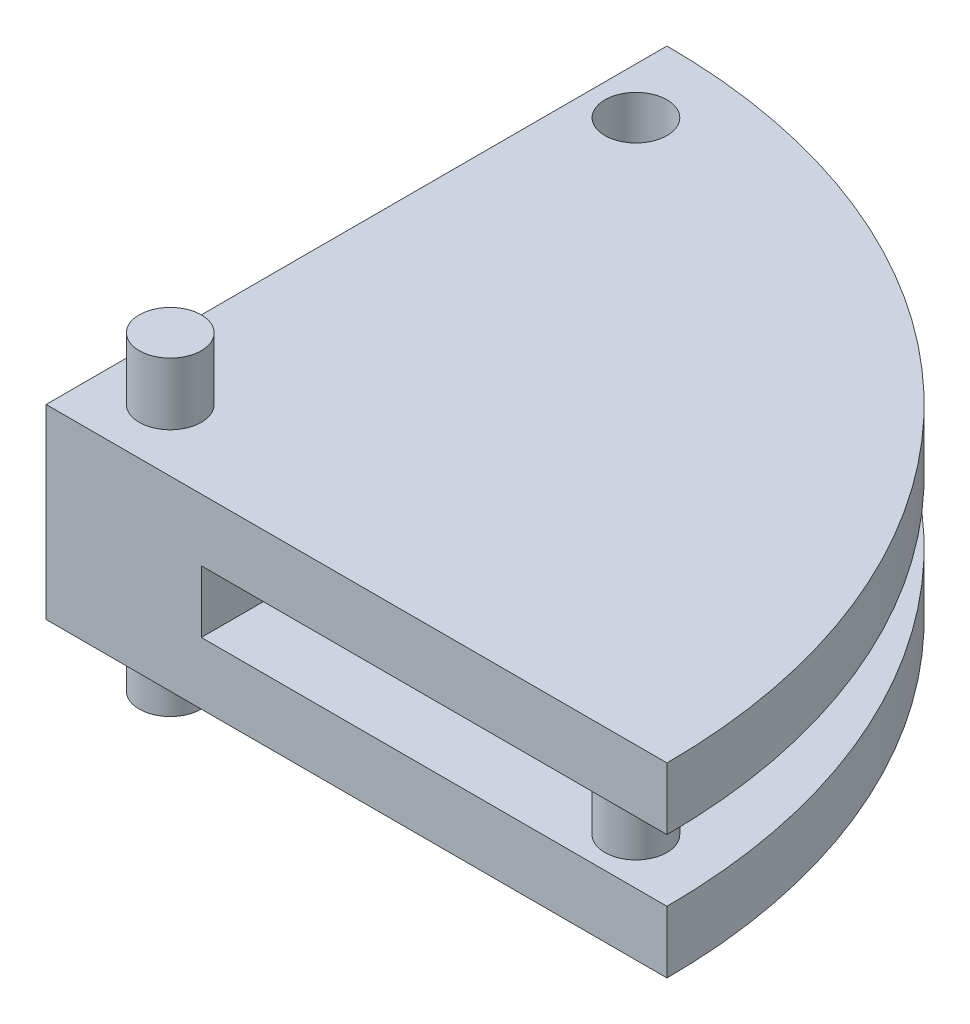
ISO-10303-21;
HEADER;
FILE_DESCRIPTION(('STEP AP214'),'2;1');
FILE_NAME('part.step','',(''),(''),'','','');
FILE_SCHEMA(('AUTOMOTIVE_DESIGN { 1 0 10303 214 1 1 1 1 }'));
ENDSEC;
DATA;
#1=APPLICATION_CONTEXT('core data for automotive mechanical design processes');
#2=APPLICATION_PROTOCOL_DEFINITION('international standard','automotive_design',2000,#1);
#3=PRODUCT_CONTEXT('',#1,'mechanical');
#4=PRODUCT('Part','Part','',(#3));
#5=PRODUCT_RELATED_PRODUCT_CATEGORY('part','',(#4));
#6=PRODUCT_DEFINITION_FORMATION('','',#4);
#7=PRODUCT_DEFINITION_CONTEXT('part definition',#1,'design');
#8=PRODUCT_DEFINITION('design','',#6,#7);
#9=PRODUCT_DEFINITION_SHAPE('','',#8);
#10=(LENGTH_UNIT() NAMED_UNIT(*) SI_UNIT(.MILLI.,.METRE.));
#11=(NAMED_UNIT(*) PLANE_ANGLE_UNIT() SI_UNIT($,.RADIAN.));
#12=(NAMED_UNIT(*) SI_UNIT($,.STERADIAN.) SOLID_ANGLE_UNIT());
#13=UNCERTAINTY_MEASURE_WITH_UNIT(LENGTH_MEASURE(1.E-05),#10,'distance_accuracy_value','');
#14=(GEOMETRIC_REPRESENTATION_CONTEXT(3) GLOBAL_UNCERTAINTY_ASSIGNED_CONTEXT((#13)) GLOBAL_UNIT_ASSIGNED_CONTEXT((#10,
#11,#12)) REPRESENTATION_CONTEXT('',''));
#15=CARTESIAN_POINT('',(0.,0.,0.));
#16=DIRECTION('',(0.,0.,1.));
#17=DIRECTION('',(1.,0.,0.));
#18=AXIS2_PLACEMENT_3D('',#15,#16,#17);
#19=CARTESIAN_POINT('',(0.,1.,0.));
#20=DIRECTION('',(0.,-1.,0.));
#21=DIRECTION('',(0.,0.,-1.));
#22=AXIS2_PLACEMENT_3D('',#19,#20,#21);
#23=PLANE('',#22);
#24=CARTESIAN_POINT('',(0.75,1.,-8.75));
#25=DIRECTION('',(0.,-1.,0.));
#26=DIRECTION('',(0.,0.,-1.));
#27=AXIS2_PLACEMENT_3D('',#24,#25,#26);
#28=CIRCLE('',#27,0.5);
#29=CARTESIAN_POINT('',(0.75,1.,-9.25));
#30=VERTEX_POINT('',#29);
#31=EDGE_CURVE('E170',#30,#30,#28,.T.);
#32=ORIENTED_EDGE('',*,*,#31,.T.);
#33=EDGE_LOOP('',(#32));
#34=FACE_BOUND('',#33,.T.);
#35=CARTESIAN_POINT('',(8.75,1.,-0.75));
#36=DIRECTION('',(0.,-1.,0.));
#37=DIRECTION('',(0.,0.,-1.));
#38=AXIS2_PLACEMENT_3D('',#35,#36,#37);
#39=CIRCLE('',#38,0.500000000000001);
#40=CARTESIAN_POINT('',(8.75,1.,-1.25));
#41=VERTEX_POINT('',#40);
#42=EDGE_CURVE('E42',#41,#41,#39,.F.);
#43=ORIENTED_EDGE('',*,*,#42,.F.);
#44=EDGE_LOOP('',(#43));
#45=FACE_BOUND('',#44,.T.);
#46=DIRECTION('',(-1.,0.,0.));
#47=VECTOR('',#46,1.);
#48=CARTESIAN_POINT('',(0.,1.,-2.5));
#49=LINE('',#48,#47);
#50=CARTESIAN_POINT('',(2.5,1.,-2.5));
#51=VERTEX_POINT('',#50);
#52=CARTESIAN_POINT('',(0.,1.,-2.5));
#53=VERTEX_POINT('',#52);
#54=EDGE_CURVE('E135',#51,#53,#49,.T.);
#55=ORIENTED_EDGE('',*,*,#54,.F.);
#56=DIRECTION('',(0.,0.,-1.));
#57=VECTOR('',#56,1.);
#58=CARTESIAN_POINT('',(2.5,1.,0.));
#59=LINE('',#58,#57);
#60=CARTESIAN_POINT('',(2.5,1.,0.));
#61=VERTEX_POINT('',#60);
#62=EDGE_CURVE('E50',#61,#51,#59,.T.);
#63=ORIENTED_EDGE('',*,*,#62,.F.);
#64=DIRECTION('',(1.,0.,0.));
#65=VECTOR('',#64,1.);
#66=CARTESIAN_POINT('',(0.,1.,0.));
#67=LINE('',#66,#65);
#68=CARTESIAN_POINT('',(10.,1.,0.));
#69=VERTEX_POINT('',#68);
#70=EDGE_CURVE('E151',#61,#69,#67,.T.);
#71=ORIENTED_EDGE('',*,*,#70,.T.);
#72=CARTESIAN_POINT('',(0.,1.,0.));
#73=DIRECTION('',(0.,1.,0.));
#74=DIRECTION('',(0.,0.,-1.));
#75=AXIS2_PLACEMENT_3D('',#72,#73,#74);
#76=CIRCLE('',#75,10.);
#77=CARTESIAN_POINT('',(0.,1.,-10.));
#78=VERTEX_POINT('',#77);
#79=EDGE_CURVE('E154',#69,#78,#76,.T.);
#80=ORIENTED_EDGE('',*,*,#79,.T.);
#81=DIRECTION('',(0.,0.,1.));
#82=VECTOR('',#81,1.);
#83=CARTESIAN_POINT('',(0.,1.,0.));
#84=LINE('',#83,#82);
#85=EDGE_CURVE('E56',#78,#53,#84,.T.);
#86=ORIENTED_EDGE('',*,*,#85,.T.);
#87=EDGE_LOOP('',(#55,#63,#71,#80,#86));
#88=FACE_BOUND('',#87,.T.);
#89=ADVANCED_FACE('F33',(#34,#45,#88),#23,.F.);
#90=CARTESIAN_POINT('',(0.,1.,0.));
#91=DIRECTION('',(1.,0.,0.));
#92=DIRECTION('',(0.,0.,-1.));
#93=AXIS2_PLACEMENT_3D('',#90,#91,#92);
#94=PLANE('',#93);
#95=DIRECTION('',(0.,0.,1.));
#96=VECTOR('',#95,1.);
#97=CARTESIAN_POINT('',(0.,0.,0.));
#98=LINE('',#97,#96);
#99=CARTESIAN_POINT('',(0.,0.,-10.));
#100=VERTEX_POINT('',#99);
#101=CARTESIAN_POINT('',(0.,0.,0.));
#102=VERTEX_POINT('',#101);
#103=EDGE_CURVE('E149',#100,#102,#98,.T.);
#104=ORIENTED_EDGE('',*,*,#103,.T.);
#105=DIRECTION('',(0.,-1.,0.));
#106=VECTOR('',#105,1.);
#107=CARTESIAN_POINT('',(0.,1.,0.));
#108=LINE('',#107,#106);
#109=CARTESIAN_POINT('',(0.,3.,0.));
#110=VERTEX_POINT('',#109);
#111=EDGE_CURVE('E107',#110,#102,#108,.T.);
#112=ORIENTED_EDGE('',*,*,#111,.F.);
#113=DIRECTION('',(0.,0.,1.));
#114=VECTOR('',#113,1.);
#115=CARTESIAN_POINT('',(0.,3.,-10.));
#116=LINE('',#115,#114);
#117=CARTESIAN_POINT('',(0.,3.,-10.));
#118=VERTEX_POINT('',#117);
#119=EDGE_CURVE('E99',#118,#110,#116,.T.);
#120=ORIENTED_EDGE('',*,*,#119,.F.);
#121=DIRECTION('',(0.,-1.,0.));
#122=VECTOR('',#121,1.);
#123=CARTESIAN_POINT('',(0.,3.,-10.));
#124=LINE('',#123,#122);
#125=CARTESIAN_POINT('',(0.,2.,-10.));
#126=VERTEX_POINT('',#125);
#127=EDGE_CURVE('E104',#118,#126,#124,.T.);
#128=ORIENTED_EDGE('',*,*,#127,.T.);
#129=DIRECTION('',(0.,0.,1.));
#130=VECTOR('',#129,1.);
#131=CARTESIAN_POINT('',(0.,2.,-10.));
#132=LINE('',#131,#130);
#133=CARTESIAN_POINT('',(0.,2.,-2.5));
#134=VERTEX_POINT('',#133);
#135=EDGE_CURVE('E187',#126,#134,#132,.T.);
#136=ORIENTED_EDGE('',*,*,#135,.T.);
#137=DIRECTION('',(0.,-1.,0.));
#138=VECTOR('',#137,1.);
#139=CARTESIAN_POINT('',(0.,2.,-2.5));
#140=LINE('',#139,#138);
#141=EDGE_CURVE('E138',#134,#53,#140,.T.);
#142=ORIENTED_EDGE('',*,*,#141,.T.);
#143=ORIENTED_EDGE('',*,*,#85,.F.);
#144=DIRECTION('',(0.,-1.,0.));
#145=VECTOR('',#144,1.);
#146=CARTESIAN_POINT('',(0.,1.,-10.));
#147=LINE('',#146,#145);
#148=EDGE_CURVE('E156',#78,#100,#147,.T.);
#149=ORIENTED_EDGE('',*,*,#148,.T.);
#150=EDGE_LOOP('',(#104,#112,#120,#128,#136,#142,#143,#149));
#151=FACE_BOUND('',#150,.T.);
#152=ADVANCED_FACE('F35',(#151),#94,.F.);
#153=CARTESIAN_POINT('',(0.,1.,0.));
#154=DIRECTION('',(0.,0.,-1.));
#155=DIRECTION('',(-1.,0.,0.));
#156=AXIS2_PLACEMENT_3D('',#153,#154,#155);
#157=PLANE('',#156);
#158=DIRECTION('',(1.,0.,0.));
#159=VECTOR('',#158,1.);
#160=CARTESIAN_POINT('',(0.,0.,0.));
#161=LINE('',#160,#159);
#162=CARTESIAN_POINT('',(10.,0.,0.));
#163=VERTEX_POINT('',#162);
#164=EDGE_CURVE('E158',#102,#163,#161,.T.);
#165=ORIENTED_EDGE('',*,*,#164,.T.);
#166=DIRECTION('',(0.,-1.,0.));
#167=VECTOR('',#166,1.);
#168=CARTESIAN_POINT('',(10.,1.,0.));
#169=LINE('',#168,#167);
#170=EDGE_CURVE('E163',#69,#163,#169,.T.);
#171=ORIENTED_EDGE('',*,*,#170,.F.);
#172=ORIENTED_EDGE('',*,*,#70,.F.);
#173=DIRECTION('',(0.,-1.,0.));
#174=VECTOR('',#173,1.);
#175=CARTESIAN_POINT('',(2.5,2.,0.));
#176=LINE('',#175,#174);
#177=CARTESIAN_POINT('',(2.5,2.,0.));
#178=VERTEX_POINT('',#177);
#179=EDGE_CURVE('E146',#178,#61,#176,.T.);
#180=ORIENTED_EDGE('',*,*,#179,.F.);
#181=DIRECTION('',(1.,0.,0.));
#182=VECTOR('',#181,1.);
#183=CARTESIAN_POINT('',(0.,2.,0.));
#184=LINE('',#183,#182);
#185=CARTESIAN_POINT('',(10.,2.,0.));
#186=VERTEX_POINT('',#185);
#187=EDGE_CURVE('E118',#178,#186,#184,.T.);
#188=ORIENTED_EDGE('',*,*,#187,.T.);
#189=DIRECTION('',(0.,-1.,0.));
#190=VECTOR('',#189,1.);
#191=CARTESIAN_POINT('',(10.,3.,0.));
#192=LINE('',#191,#190);
#193=CARTESIAN_POINT('',(10.,3.,0.));
#194=VERTEX_POINT('',#193);
#195=EDGE_CURVE('E124',#194,#186,#192,.T.);
#196=ORIENTED_EDGE('',*,*,#195,.F.);
#197=DIRECTION('',(1.,0.,0.));
#198=VECTOR('',#197,1.);
#199=CARTESIAN_POINT('',(0.,3.,0.));
#200=LINE('',#199,#198);
#201=EDGE_CURVE('E110',#110,#194,#200,.T.);
#202=ORIENTED_EDGE('',*,*,#201,.F.);
#203=ORIENTED_EDGE('',*,*,#111,.T.);
#204=EDGE_LOOP('',(#165,#171,#172,#180,#188,#196,#202,#203));
#205=FACE_BOUND('',#204,.T.);
#206=ADVANCED_FACE('F190',(#205),#157,.F.);
#207=CARTESIAN_POINT('',(0.,1.,0.));
#208=DIRECTION('',(0.,-1.,0.));
#209=DIRECTION('',(0.,0.,-1.));
#210=AXIS2_PLACEMENT_3D('',#207,#208,#209);
#211=CYLINDRICAL_SURFACE('',#210,10.);
#212=CARTESIAN_POINT('',(0.,0.,0.));
#213=DIRECTION('',(0.,1.,0.));
#214=DIRECTION('',(0.,0.,-1.));
#215=AXIS2_PLACEMENT_3D('',#212,#213,#214);
#216=CIRCLE('',#215,10.);
#217=EDGE_CURVE('E152',#163,#100,#216,.T.);
#218=ORIENTED_EDGE('',*,*,#217,.T.);
#219=ORIENTED_EDGE('',*,*,#148,.F.);
#220=ORIENTED_EDGE('',*,*,#79,.F.);
#221=ORIENTED_EDGE('',*,*,#170,.T.);
#222=EDGE_LOOP('',(#218,#219,#220,#221));
#223=FACE_BOUND('',#222,.T.);
#224=ADVANCED_FACE('F208',(#223),#211,.T.);
#225=CARTESIAN_POINT('',(0.,0.,0.));
#226=DIRECTION('',(0.,-1.,0.));
#227=DIRECTION('',(0.,0.,-1.));
#228=AXIS2_PLACEMENT_3D('',#225,#226,#227);
#229=PLANE('',#228);
#230=CARTESIAN_POINT('',(1.,0.,-1.));
#231=DIRECTION('',(0.,-1.,0.));
#232=DIRECTION('',(0.,0.,-1.));
#233=AXIS2_PLACEMENT_3D('',#230,#231,#232);
#234=CIRCLE('',#233,0.5);
#235=CARTESIAN_POINT('',(1.,0.,-1.5));
#236=VERTEX_POINT('',#235);
#237=EDGE_CURVE('E11',#236,#236,#234,.T.);
#238=ORIENTED_EDGE('',*,*,#237,.F.);
#239=EDGE_LOOP('',(#238));
#240=FACE_BOUND('',#239,.T.);
#241=CARTESIAN_POINT('',(0.75,0.,-8.75));
#242=DIRECTION('',(0.,1.,0.));
#243=DIRECTION('',(0.,0.,1.));
#244=AXIS2_PLACEMENT_3D('',#241,#242,#243);
#245=CIRCLE('',#244,0.5);
#246=CARTESIAN_POINT('',(0.75,0.,-8.25));
#247=VERTEX_POINT('',#246);
#248=EDGE_CURVE('E171',#247,#247,#245,.T.);
#249=ORIENTED_EDGE('',*,*,#248,.T.);
#250=EDGE_LOOP('',(#249));
#251=FACE_BOUND('',#250,.T.);
#252=ORIENTED_EDGE('',*,*,#103,.F.);
#253=ORIENTED_EDGE('',*,*,#217,.F.);
#254=ORIENTED_EDGE('',*,*,#164,.F.);
#255=EDGE_LOOP('',(#252,#253,#254));
#256=FACE_BOUND('',#255,.T.);
#257=ADVANCED_FACE('F200',(#240,#251,#256),#229,.T.);
#258=CARTESIAN_POINT('',(2.5,2.,0.));
#259=DIRECTION('',(-1.,0.,0.));
#260=DIRECTION('',(0.,0.,1.));
#261=AXIS2_PLACEMENT_3D('',#258,#259,#260);
#262=PLANE('',#261);
#263=ORIENTED_EDGE('',*,*,#62,.T.);
#264=DIRECTION('',(0.,-1.,0.));
#265=VECTOR('',#264,1.);
#266=CARTESIAN_POINT('',(2.5,2.,-2.5));
#267=LINE('',#266,#265);
#268=CARTESIAN_POINT('',(2.5,2.,-2.5));
#269=VERTEX_POINT('',#268);
#270=EDGE_CURVE('E143',#269,#51,#267,.T.);
#271=ORIENTED_EDGE('',*,*,#270,.F.);
#272=DIRECTION('',(0.,0.,-1.));
#273=VECTOR('',#272,1.);
#274=CARTESIAN_POINT('',(2.5,2.,0.));
#275=LINE('',#274,#273);
#276=EDGE_CURVE('E131',#178,#269,#275,.T.);
#277=ORIENTED_EDGE('',*,*,#276,.F.);
#278=ORIENTED_EDGE('',*,*,#179,.T.);
#279=EDGE_LOOP('',(#263,#271,#277,#278));
#280=FACE_BOUND('',#279,.T.);
#281=ADVANCED_FACE('F198',(#280),#262,.F.);
#282=CARTESIAN_POINT('',(0.,2.,-2.5));
#283=DIRECTION('',(0.,0.,1.));
#284=DIRECTION('',(1.,0.,0.));
#285=AXIS2_PLACEMENT_3D('',#282,#283,#284);
#286=PLANE('',#285);
#287=ORIENTED_EDGE('',*,*,#54,.T.);
#288=ORIENTED_EDGE('',*,*,#141,.F.);
#289=DIRECTION('',(-1.,0.,0.));
#290=VECTOR('',#289,1.);
#291=CARTESIAN_POINT('',(0.,2.,-2.5));
#292=LINE('',#291,#290);
#293=EDGE_CURVE('E134',#269,#134,#292,.T.);
#294=ORIENTED_EDGE('',*,*,#293,.F.);
#295=ORIENTED_EDGE('',*,*,#270,.T.);
#296=EDGE_LOOP('',(#287,#288,#294,#295));
#297=FACE_BOUND('',#296,.T.);
#298=ADVANCED_FACE('F196',(#297),#286,.F.);
#299=CARTESIAN_POINT('',(8.75,2.,-0.75));
#300=DIRECTION('',(0.,-1.,0.));
#301=DIRECTION('',(0.,0.,-1.));
#302=AXIS2_PLACEMENT_3D('',#299,#300,#301);
#303=CYLINDRICAL_SURFACE('',#302,0.500000000000001);
#304=CARTESIAN_POINT('',(8.75,2.,-0.75));
#305=DIRECTION('',(0.,1.,0.));
#306=DIRECTION('',(0.,0.,1.));
#307=AXIS2_PLACEMENT_3D('',#304,#305,#306);
#308=CIRCLE('',#307,0.500000000000001);
#309=CARTESIAN_POINT('',(8.75,2.,-0.249999999999999));
#310=VERTEX_POINT('',#309);
#311=EDGE_CURVE('E123',#310,#310,#308,.T.);
#312=ORIENTED_EDGE('',*,*,#311,.F.);
#313=EDGE_LOOP('',(#312));
#314=FACE_BOUND('',#313,.T.);
#315=ORIENTED_EDGE('',*,*,#42,.T.);
#316=EDGE_LOOP('',(#315));
#317=FACE_BOUND('',#316,.T.);
#318=ADVANCED_FACE('F206',(#314,#317),#303,.T.);
#319=CARTESIAN_POINT('',(0.,3.,0.));
#320=DIRECTION('',(0.,-1.,0.));
#321=DIRECTION('',(0.,0.,-1.));
#322=AXIS2_PLACEMENT_3D('',#319,#320,#321);
#323=CYLINDRICAL_SURFACE('',#322,10.);
#324=CARTESIAN_POINT('',(0.,2.,0.));
#325=DIRECTION('',(0.,1.,0.));
#326=DIRECTION('',(0.,0.,-1.));
#327=AXIS2_PLACEMENT_3D('',#324,#325,#326);
#328=CIRCLE('',#327,10.);
#329=EDGE_CURVE('E122',#186,#126,#328,.T.);
#330=ORIENTED_EDGE('',*,*,#329,.T.);
#331=ORIENTED_EDGE('',*,*,#127,.F.);
#332=CARTESIAN_POINT('',(0.,3.,0.));
#333=DIRECTION('',(0.,1.,0.));
#334=DIRECTION('',(0.,0.,-1.));
#335=AXIS2_PLACEMENT_3D('',#332,#333,#334);
#336=CIRCLE('',#335,10.);
#337=EDGE_CURVE('E111',#194,#118,#336,.T.);
#338=ORIENTED_EDGE('',*,*,#337,.F.);
#339=ORIENTED_EDGE('',*,*,#195,.T.);
#340=EDGE_LOOP('',(#330,#331,#338,#339));
#341=FACE_BOUND('',#340,.T.);
#342=ADVANCED_FACE('F120',(#341),#323,.T.);
#343=CARTESIAN_POINT('',(0.,3.,0.));
#344=DIRECTION('',(0.,-1.,0.));
#345=DIRECTION('',(0.,0.,-1.));
#346=AXIS2_PLACEMENT_3D('',#343,#344,#345);
#347=PLANE('',#346);
#348=CARTESIAN_POINT('',(1.,3.,-1.));
#349=DIRECTION('',(0.,-1.,0.));
#350=DIRECTION('',(0.,0.,-1.));
#351=AXIS2_PLACEMENT_3D('',#348,#349,#350);
#352=CIRCLE('',#351,0.5);
#353=CARTESIAN_POINT('',(1.,3.,-1.5));
#354=VERTEX_POINT('',#353);
#355=EDGE_CURVE('E37',#354,#354,#352,.T.);
#356=ORIENTED_EDGE('',*,*,#355,.T.);
#357=EDGE_LOOP('',(#356));
#358=FACE_BOUND('',#357,.T.);
#359=CARTESIAN_POINT('',(0.75,3.,-8.75));
#360=DIRECTION('',(0.,1.,0.));
#361=DIRECTION('',(0.,0.,1.));
#362=AXIS2_PLACEMENT_3D('',#359,#360,#361);
#363=CIRCLE('',#362,0.5);
#364=CARTESIAN_POINT('',(0.75,3.,-8.25));
#365=VERTEX_POINT('',#364);
#366=EDGE_CURVE('E177',#365,#365,#363,.T.);
#367=ORIENTED_EDGE('',*,*,#366,.F.);
#368=EDGE_LOOP('',(#367));
#369=FACE_BOUND('',#368,.T.);
#370=ORIENTED_EDGE('',*,*,#337,.T.);
#371=ORIENTED_EDGE('',*,*,#119,.T.);
#372=ORIENTED_EDGE('',*,*,#201,.T.);
#373=EDGE_LOOP('',(#370,#371,#372));
#374=FACE_BOUND('',#373,.T.);
#375=ADVANCED_FACE('F114',(#358,#369,#374),#347,.F.);
#376=CARTESIAN_POINT('',(0.,2.,0.));
#377=DIRECTION('',(0.,-1.,0.));
#378=DIRECTION('',(0.,0.,-1.));
#379=AXIS2_PLACEMENT_3D('',#376,#377,#378);
#380=PLANE('',#379);
#381=CARTESIAN_POINT('',(0.75,2.,-8.75));
#382=DIRECTION('',(0.,-1.,0.));
#383=DIRECTION('',(0.,0.,-1.));
#384=AXIS2_PLACEMENT_3D('',#381,#382,#383);
#385=CIRCLE('',#384,0.5);
#386=CARTESIAN_POINT('',(0.75,2.,-9.25));
#387=VERTEX_POINT('',#386);
#388=EDGE_CURVE('E168',#387,#387,#385,.T.);
#389=ORIENTED_EDGE('',*,*,#388,.F.);
#390=EDGE_LOOP('',(#389));
#391=FACE_BOUND('',#390,.T.);
#392=ORIENTED_EDGE('',*,*,#311,.T.);
#393=EDGE_LOOP('',(#392));
#394=FACE_BOUND('',#393,.T.);
#395=ORIENTED_EDGE('',*,*,#187,.F.);
#396=ORIENTED_EDGE('',*,*,#276,.T.);
#397=ORIENTED_EDGE('',*,*,#293,.T.);
#398=ORIENTED_EDGE('',*,*,#135,.F.);
#399=ORIENTED_EDGE('',*,*,#329,.F.);
#400=EDGE_LOOP('',(#395,#396,#397,#398,#399));
#401=FACE_BOUND('',#400,.T.);
#402=ADVANCED_FACE('F193',(#391,#394,#401),#380,.T.);
#403=CARTESIAN_POINT('',(0.75,0.,-8.75));
#404=DIRECTION('',(0.,1.,0.));
#405=DIRECTION('',(0.,0.,1.));
#406=AXIS2_PLACEMENT_3D('',#403,#404,#405);
#407=CYLINDRICAL_SURFACE('',#406,0.5);
#408=ORIENTED_EDGE('',*,*,#388,.T.);
#409=EDGE_LOOP('',(#408));
#410=FACE_BOUND('',#409,.T.);
#411=ORIENTED_EDGE('',*,*,#366,.T.);
#412=EDGE_LOOP('',(#411));
#413=FACE_BOUND('',#412,.T.);
#414=ADVANCED_FACE('F300',(#410,#413),#407,.F.);
#415=ORIENTED_EDGE('',*,*,#248,.F.);
#416=EDGE_LOOP('',(#415));
#417=FACE_BOUND('',#416,.T.);
#418=ORIENTED_EDGE('',*,*,#31,.F.);
#419=EDGE_LOOP('',(#418));
#420=FACE_BOUND('',#419,.T.);
#421=ADVANCED_FACE('F242',(#417,#420),#407,.F.);
#422=CARTESIAN_POINT('',(1.,4.,-1.));
#423=DIRECTION('',(0.,1.,0.));
#424=DIRECTION('',(0.,0.,1.));
#425=AXIS2_PLACEMENT_3D('',#422,#423,#424);
#426=PLANE('',#425);
#427=CARTESIAN_POINT('',(1.,4.,-1.));
#428=DIRECTION('',(0.,1.,0.));
#429=DIRECTION('',(0.,0.,1.));
#430=AXIS2_PLACEMENT_3D('',#427,#428,#429);
#431=CIRCLE('',#430,0.5);
#432=CARTESIAN_POINT('',(1.,4.,-0.5));
#433=VERTEX_POINT('',#432);
#434=EDGE_CURVE('E377',#433,#433,#431,.T.);
#435=ORIENTED_EDGE('',*,*,#434,.T.);
#436=EDGE_LOOP('',(#435));
#437=FACE_BOUND('',#436,.T.);
#438=ADVANCED_FACE('F260',(#437),#426,.T.);
#439=CARTESIAN_POINT('',(1.,-1.,-1.));
#440=DIRECTION('',(0.,1.,0.));
#441=DIRECTION('',(0.,0.,1.));
#442=AXIS2_PLACEMENT_3D('',#439,#440,#441);
#443=CYLINDRICAL_SURFACE('',#442,0.5);
#444=ORIENTED_EDGE('',*,*,#434,.F.);
#445=EDGE_LOOP('',(#444));
#446=FACE_BOUND('',#445,.T.);
#447=ORIENTED_EDGE('',*,*,#355,.F.);
#448=EDGE_LOOP('',(#447));
#449=FACE_BOUND('',#448,.T.);
#450=ADVANCED_FACE('F265',(#446,#449),#443,.T.);
#451=ORIENTED_EDGE('',*,*,#237,.T.);
#452=EDGE_LOOP('',(#451));
#453=FACE_BOUND('',#452,.T.);
#454=CARTESIAN_POINT('',(1.,-1.,-1.));
#455=DIRECTION('',(0.,1.,0.));
#456=DIRECTION('',(0.,0.,1.));
#457=AXIS2_PLACEMENT_3D('',#454,#455,#456);
#458=CIRCLE('',#457,0.5);
#459=CARTESIAN_POINT('',(1.,-1.,-0.5));
#460=VERTEX_POINT('',#459);
#461=EDGE_CURVE('E375',#460,#460,#458,.T.);
#462=ORIENTED_EDGE('',*,*,#461,.T.);
#463=EDGE_LOOP('',(#462));
#464=FACE_BOUND('',#463,.T.);
#465=ADVANCED_FACE('F275',(#453,#464),#443,.T.);
#466=CARTESIAN_POINT('',(1.,-1.,-1.));
#467=DIRECTION('',(0.,1.,0.));
#468=DIRECTION('',(0.,0.,1.));
#469=AXIS2_PLACEMENT_3D('',#466,#467,#468);
#470=PLANE('',#469);
#471=ORIENTED_EDGE('',*,*,#461,.F.);
#472=EDGE_LOOP('',(#471));
#473=FACE_BOUND('',#472,.T.);
#474=ADVANCED_FACE('F285',(#473),#470,.F.);
#475=CLOSED_SHELL('',(#89,#152,#206,#224,#257,#281,#298,#318,#342,#375,#402,#414,#421,#438,#450,
#465,#474));
#476=MANIFOLD_SOLID_BREP('B2',#475);
#477=ADVANCED_BREP_SHAPE_REPRESENTATION('',(#18,#476),#14);
#478=SHAPE_DEFINITION_REPRESENTATION(#9,#477);
ENDSEC;
END-ISO-10303-21;
